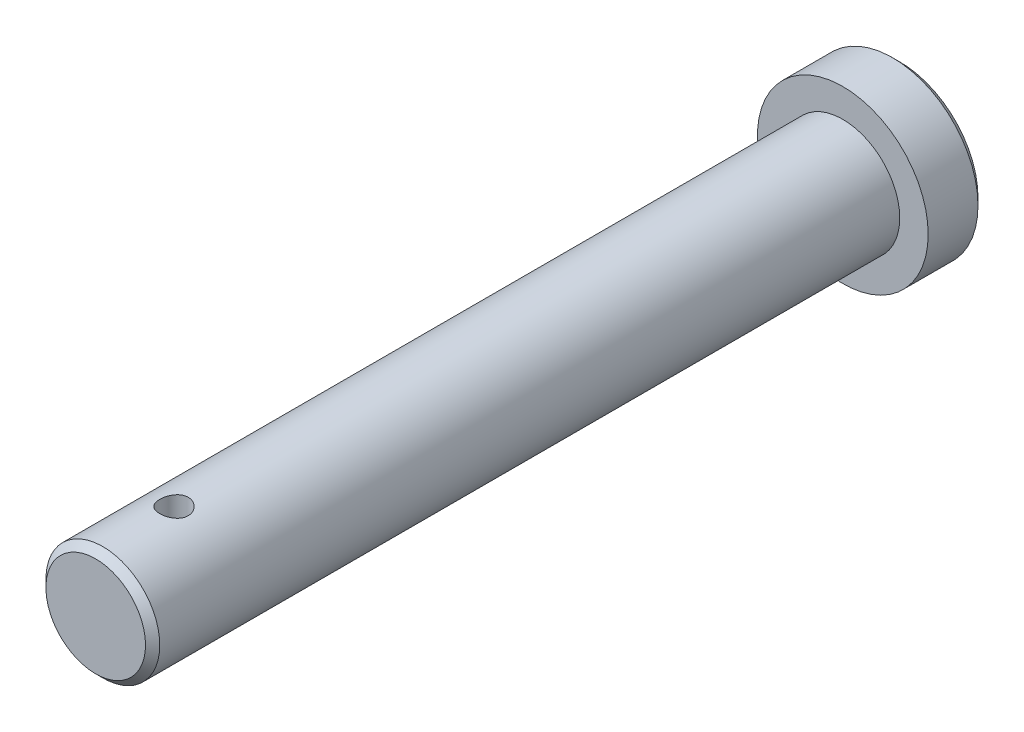
ISO-10303-21;
HEADER;
FILE_DESCRIPTION(('STEP AP214'),'2;1');
FILE_NAME('part.step','',(''),(''),'','','');
FILE_SCHEMA(('AUTOMOTIVE_DESIGN { 1 0 10303 214 1 1 1 1 }'));
ENDSEC;
DATA;
#1=APPLICATION_CONTEXT('core data for automotive mechanical design processes');
#2=APPLICATION_PROTOCOL_DEFINITION('international standard','automotive_design',2000,#1);
#3=PRODUCT_CONTEXT('',#1,'mechanical');
#4=PRODUCT('Part','Part','',(#3));
#5=PRODUCT_RELATED_PRODUCT_CATEGORY('part','',(#4));
#6=PRODUCT_DEFINITION_FORMATION('','',#4);
#7=PRODUCT_DEFINITION_CONTEXT('part definition',#1,'design');
#8=PRODUCT_DEFINITION('design','',#6,#7);
#9=PRODUCT_DEFINITION_SHAPE('','',#8);
#10=(LENGTH_UNIT() NAMED_UNIT(*) SI_UNIT(.MILLI.,.METRE.));
#11=(NAMED_UNIT(*) PLANE_ANGLE_UNIT() SI_UNIT($,.RADIAN.));
#12=(NAMED_UNIT(*) SI_UNIT($,.STERADIAN.) SOLID_ANGLE_UNIT());
#13=UNCERTAINTY_MEASURE_WITH_UNIT(LENGTH_MEASURE(1.E-05),#10,'distance_accuracy_value','');
#14=(GEOMETRIC_REPRESENTATION_CONTEXT(3) GLOBAL_UNCERTAINTY_ASSIGNED_CONTEXT((#13)) GLOBAL_UNIT_ASSIGNED_CONTEXT((#10,
#11,#12)) REPRESENTATION_CONTEXT('',''));
#15=CARTESIAN_POINT('',(0.,0.,0.));
#16=DIRECTION('',(0.,0.,1.));
#17=DIRECTION('',(1.,0.,0.));
#18=AXIS2_PLACEMENT_3D('',#15,#16,#17);
#19=CARTESIAN_POINT('',(0.,0.,8.));
#20=DIRECTION('',(0.,0.,-1.));
#21=DIRECTION('',(-1.,0.,0.));
#22=AXIS2_PLACEMENT_3D('',#19,#20,#21);
#23=CYLINDRICAL_SURFACE('',#22,12.);
#24=CARTESIAN_POINT('',(0.,0.,1.));
#25=DIRECTION('',(0.,0.,1.));
#26=DIRECTION('',(1.,0.,0.));
#27=AXIS2_PLACEMENT_3D('',#24,#25,#26);
#28=CIRCLE('',#27,12.);
#29=CARTESIAN_POINT('',(12.,0.,1.));
#30=VERTEX_POINT('',#29);
#31=EDGE_CURVE('E99',#30,#30,#28,.T.);
#32=ORIENTED_EDGE('',*,*,#31,.T.);
#33=EDGE_LOOP('',(#32));
#34=FACE_BOUND('',#33,.T.);
#35=CARTESIAN_POINT('',(0.,0.,8.));
#36=DIRECTION('',(0.,0.,1.));
#37=DIRECTION('',(1.,0.,0.));
#38=AXIS2_PLACEMENT_3D('',#35,#36,#37);
#39=CIRCLE('',#38,12.);
#40=CARTESIAN_POINT('',(12.,0.,8.));
#41=VERTEX_POINT('',#40);
#42=EDGE_CURVE('E100',#41,#41,#39,.T.);
#43=ORIENTED_EDGE('',*,*,#42,.F.);
#44=EDGE_LOOP('',(#43));
#45=FACE_BOUND('',#44,.T.);
#46=ADVANCED_FACE('F31',(#34,#45),#23,.T.);
#47=CARTESIAN_POINT('',(0.,0.,8.));
#48=DIRECTION('',(0.,0.,1.));
#49=DIRECTION('',(1.,0.,0.));
#50=AXIS2_PLACEMENT_3D('',#47,#48,#49);
#51=PLANE('',#50);
#52=CARTESIAN_POINT('',(0.,0.,8.));
#53=DIRECTION('',(0.,0.,1.));
#54=DIRECTION('',(1.,0.,0.));
#55=AXIS2_PLACEMENT_3D('',#52,#53,#54);
#56=CIRCLE('',#55,8.);
#57=CARTESIAN_POINT('',(8.,0.,8.));
#58=VERTEX_POINT('',#57);
#59=EDGE_CURVE('E49',#58,#58,#56,.T.);
#60=ORIENTED_EDGE('',*,*,#59,.F.);
#61=EDGE_LOOP('',(#60));
#62=FACE_BOUND('',#61,.T.);
#63=ORIENTED_EDGE('',*,*,#42,.T.);
#64=EDGE_LOOP('',(#63));
#65=FACE_BOUND('',#64,.T.);
#66=ADVANCED_FACE('F77',(#62,#65),#51,.T.);
#67=CARTESIAN_POINT('',(0.,0.,0.));
#68=DIRECTION('',(0.,0.,1.));
#69=DIRECTION('',(1.,0.,0.));
#70=AXIS2_PLACEMENT_3D('',#67,#68,#69);
#71=PLANE('',#70);
#72=CARTESIAN_POINT('',(0.,0.,0.));
#73=DIRECTION('',(0.,0.,1.));
#74=DIRECTION('',(1.,0.,0.));
#75=AXIS2_PLACEMENT_3D('',#72,#73,#74);
#76=CIRCLE('',#75,11.);
#77=CARTESIAN_POINT('',(11.,0.,0.));
#78=VERTEX_POINT('',#77);
#79=EDGE_CURVE('E97',#78,#78,#76,.F.);
#80=ORIENTED_EDGE('',*,*,#79,.T.);
#81=EDGE_LOOP('',(#80));
#82=FACE_BOUND('',#81,.T.);
#83=ADVANCED_FACE('F83',(#82),#71,.F.);
#84=CARTESIAN_POINT('',(0.,0.,1.));
#85=DIRECTION('',(0.,0.,1.));
#86=DIRECTION('',(1.,0.,0.));
#87=AXIS2_PLACEMENT_3D('',#84,#85,#86);
#88=CONICAL_SURFACE('',#87,12.,0.785398163397449);
#89=ORIENTED_EDGE('',*,*,#79,.F.);
#90=EDGE_LOOP('',(#89));
#91=FACE_BOUND('',#90,.T.);
#92=ORIENTED_EDGE('',*,*,#31,.F.);
#93=EDGE_LOOP('',(#92));
#94=FACE_BOUND('',#93,.T.);
#95=ADVANCED_FACE('F74',(#91,#94),#88,.T.);
#96=CARTESIAN_POINT('',(0.,0.,113.));
#97=DIRECTION('',(0.,0.,-1.));
#98=DIRECTION('',(-1.,0.,0.));
#99=AXIS2_PLACEMENT_3D('',#96,#97,#98);
#100=CYLINDRICAL_SURFACE('',#99,8.);
#101=CARTESIAN_POINT('',(0.,-8.,104.));
#102=CARTESIAN_POINT('',(0.110501451559641,-7.9999981315735,103.999996899016));
#103=CARTESIAN_POINT('',(0.22103754377435,-7.99768770842435,103.990811265635));
#104=CARTESIAN_POINT('',(0.438941765027375,-7.98869485106526,103.954366464924));
#105=CARTESIAN_POINT('',(0.546308062494318,-7.98200993893301,103.92709705395));
#106=CARTESIAN_POINT('',(0.754694496243438,-7.96500835109376,103.855414328717));
#107=CARTESIAN_POINT('',(0.855722084573341,-7.95469603789411,103.811021601713));
#108=CARTESIAN_POINT('',(1.04889617587257,-7.93153791743495,103.706424813274));
#109=CARTESIAN_POINT('',(1.14104237913168,-7.91869202472209,103.646220218508));
#110=CARTESIAN_POINT('',(1.31573590306788,-7.89156551455591,103.510398947128));
#111=CARTESIAN_POINT('',(1.39807425341474,-7.87726276197502,103.434517900055));
#112=CARTESIAN_POINT('',(1.54899856960442,-7.84898160157248,103.270063726788));
#113=CARTESIAN_POINT('',(1.61758298259892,-7.83500323053157,103.181489169404));
#114=CARTESIAN_POINT('',(1.74003539039863,-7.80873034264225,102.992539697684));
#115=CARTESIAN_POINT('',(1.79366962123352,-7.79646392619748,102.892009025588));
#116=CARTESIAN_POINT('',(1.88319587806766,-7.77532659757355,102.683002117787));
#117=CARTESIAN_POINT('',(1.91909074058685,-7.76645514259225,102.574527155557));
#118=CARTESIAN_POINT('',(1.97140644907302,-7.7533396892843,102.355008669064));
#119=CARTESIAN_POINT('',(1.98820302444274,-7.74900654662681,102.244060138616));
#120=CARTESIAN_POINT('',(2.00301570008854,-7.74519149946122,102.020841908001));
#121=CARTESIAN_POINT('',(2.00103485575748,-7.74570880570571,101.908572425744));
#122=CARTESIAN_POINT('',(1.97864869951961,-7.75145607355756,101.688778923006));
#123=CARTESIAN_POINT('',(1.95869112025418,-7.75657150676391,101.581205838046));
#124=CARTESIAN_POINT('',(1.90163224920399,-7.77075612894758,101.370985265452));
#125=CARTESIAN_POINT('',(1.86452973609253,-7.77982559958985,101.268338129295));
#126=CARTESIAN_POINT('',(1.77385263724958,-7.80100151874212,101.069682644997));
#127=CARTESIAN_POINT('',(1.72011555631056,-7.81313769959755,100.973751770947));
#128=CARTESIAN_POINT('',(1.59780836801993,-7.83906281127988,100.792108386991));
#129=CARTESIAN_POINT('',(1.52923566507845,-7.85285203112837,100.706397669244));
#130=CARTESIAN_POINT('',(1.37688456624163,-7.88101174053188,100.545061845741));
#131=CARTESIAN_POINT('',(1.29272834422115,-7.89538759304001,100.469794013252));
#132=CARTESIAN_POINT('',(1.11281589000494,-7.92274620771675,100.334371676715));
#133=CARTESIAN_POINT('',(1.0170593036106,-7.93572892732543,100.274217634315));
#134=CARTESIAN_POINT('',(0.816154518241863,-7.9589030945892,100.170599218367));
#135=CARTESIAN_POINT('',(0.710975190944839,-7.96908480170303,100.127192879661));
#136=CARTESIAN_POINT('',(0.494501344190514,-7.98543889321888,100.058776925721));
#137=CARTESIAN_POINT('',(0.383207998867314,-7.99161204452374,100.033763791442));
#138=CARTESIAN_POINT('',(0.160719960520034,-7.999139990285,100.003389912588));
#139=CARTESIAN_POINT('',(0.0495956266509452,-8.00061404677705,99.9975426318996));
#140=CARTESIAN_POINT('',(-0.172043833068677,-7.99891739752601,100.004332002741));
#141=CARTESIAN_POINT('',(-0.282559012859458,-7.99574710989128,100.016966990399));
#142=CARTESIAN_POINT('',(-0.498152358368654,-7.98519441503143,100.059961211188));
#143=CARTESIAN_POINT('',(-0.603286825291672,-7.97787512247748,100.090055017969));
#144=CARTESIAN_POINT('',(-0.807009723270014,-7.95984942178845,100.166809445371));
#145=CARTESIAN_POINT('',(-0.905597492043511,-7.94914267159856,100.213471739084));
#146=CARTESIAN_POINT('',(-1.09536417923979,-7.92524410568414,100.322981505166));
#147=CARTESIAN_POINT('',(-1.18638058911444,-7.91201156489243,100.386101483196));
#148=CARTESIAN_POINT('',(-1.35670215152433,-7.88459345583226,100.526386545063));
#149=CARTESIAN_POINT('',(-1.43600527863068,-7.87040772335606,100.603554052823));
#150=CARTESIAN_POINT('',(-1.58265409076364,-7.84225275947695,100.772002614459));
#151=CARTESIAN_POINT('',(-1.6496584901627,-7.82829738916375,100.863583604003));
#152=CARTESIAN_POINT('',(-1.76734767868359,-7.80257171169652,101.056976845954));
#153=CARTESIAN_POINT('',(-1.81803319221058,-7.79080130756035,101.158788643946));
#154=CARTESIAN_POINT('',(-1.90126856081238,-7.77090792979553,101.369207629884));
#155=CARTESIAN_POINT('',(-1.93392586220542,-7.76276340389207,101.477770171125));
#156=CARTESIAN_POINT('',(-1.98046087993837,-7.75102325453578,101.699079517185));
#157=CARTESIAN_POINT('',(-1.99434270330488,-7.74742663626582,101.811825401377));
#158=CARTESIAN_POINT('',(-2.00271812044533,-7.74526534938609,102.034828031807));
#159=CARTESIAN_POINT('',(-1.99775719704016,-7.74655910304351,102.145063246833));
#160=CARTESIAN_POINT('',(-1.96983637108382,-7.7537054534379,102.363071851557));
#161=CARTESIAN_POINT('',(-1.94687683024903,-7.75955795855809,102.470845290685));
#162=CARTESIAN_POINT('',(-1.88390842592373,-7.77508347576963,102.680277945421));
#163=CARTESIAN_POINT('',(-1.84400187290717,-7.78473353648412,102.78196974032));
#164=CARTESIAN_POINT('',(-1.7483532181401,-7.80677007633104,102.977287176952));
#165=CARTESIAN_POINT('',(-1.69260892004559,-7.81915693494364,103.070911697583));
#166=CARTESIAN_POINT('',(-1.56515699818286,-7.84567512351349,103.250072838669));
#167=CARTESIAN_POINT('',(-1.49307088388301,-7.85984353109009,103.335334764565));
#168=CARTESIAN_POINT('',(-1.33571916158632,-7.88810702995047,103.492729393061));
#169=CARTESIAN_POINT('',(-1.2504504283482,-7.90220210302746,103.564858973484));
#170=CARTESIAN_POINT('',(-1.06729011560345,-7.92903540863551,103.695215078086));
#171=CARTESIAN_POINT('',(-0.969197896421848,-7.94174444487824,103.753166151562));
#172=CARTESIAN_POINT('',(-0.764354746013968,-7.96406566633491,103.851663283921));
#173=CARTESIAN_POINT('',(-0.65761008458232,-7.97368006933042,103.892221814198));
#174=CARTESIAN_POINT('',(-0.459213670991296,-7.98730746087389,103.94876244044));
#175=CARTESIAN_POINT('',(-0.368506894544091,-7.9920344673692,103.967934990738));
#176=CARTESIAN_POINT('',(-0.185208095381711,-7.99838140309264,103.993554591496));
#177=CARTESIAN_POINT('',(-0.092616214990155,-8.00000156601192,104.000002599074));
#178=CARTESIAN_POINT('',(0.,-8.,104.));
#179=B_SPLINE_CURVE_WITH_KNOTS('',3,(#101,#102,#103,#104,#105,#106,#107,#108,#109,#110,#111,
#112,#113,#114,#115,#116,#117,#118,#119,#120,#121,#122,#123,#124,#125,#126,#127,#128,#129,#130,
#131,#132,#133,#134,#135,#136,#137,#138,#139,#140,#141,#142,#143,#144,#145,#146,#147,#148,#149,
#150,#151,#152,#153,#154,#155,#156,#157,#158,#159,#160,#161,#162,#163,#164,#165,#166,#167,#168,
#169,#170,#171,#172,#173,#174,#175,#176,#177,#178),.UNSPECIFIED.,.T.,.F.,(4,2,2,2,2,2,2,2,2,2,2,
2,2,2,2,2,2,2,2,2,2,2,2,2,2,2,2,2,2,2,2,2,2,2,2,2,2,2,4),(0.,0.331164949962518,
0.662517650351866,0.993473203048152,1.32443992022577,1.66152580582851,1.99864972773416,
2.34078196727742,2.68285948225824,3.01808393468093,3.35325384154689,3.68029996013784,
4.00736937959146,4.33774037169599,4.66816921119311,5.00802001296453,5.34788119415423,
5.68890972016579,6.02987298255951,6.36211078603462,6.69431868154751,7.02160366023144,
7.34892169767481,7.68204783424896,8.01523150681786,8.35659345610394,8.69794025003771,
9.03723006156475,9.3764456434097,9.70591707202578,10.0353818794581,10.3628853408369,
10.6904342418696,11.0265276855097,11.3627009303165,11.7049624733721,12.0469781843289,
12.3245632392729,12.6021274139515),.UNSPECIFIED.);
#180=CARTESIAN_POINT('',(0.,-8.,104.));
#181=VERTEX_POINT('',#180);
#182=EDGE_CURVE('E35',#181,#181,#179,.T.);
#183=ORIENTED_EDGE('',*,*,#182,.T.);
#184=EDGE_LOOP('',(#183));
#185=FACE_BOUND('',#184,.T.);
#186=CARTESIAN_POINT('',(0.,8.,104.));
#187=CARTESIAN_POINT('',(-0.110501451559641,7.9999981315735,103.999996899016));
#188=CARTESIAN_POINT('',(-0.22103754377435,7.99768770842435,103.990811265635));
#189=CARTESIAN_POINT('',(-0.438941765027375,7.98869485106526,103.954366464924));
#190=CARTESIAN_POINT('',(-0.546308062494318,7.98200993893301,103.92709705395));
#191=CARTESIAN_POINT('',(-0.754694496243438,7.96500835109376,103.855414328717));
#192=CARTESIAN_POINT('',(-0.855722084573341,7.95469603789411,103.811021601713));
#193=CARTESIAN_POINT('',(-1.04889617587257,7.93153791743495,103.706424813274));
#194=CARTESIAN_POINT('',(-1.14104237913168,7.91869202472209,103.646220218508));
#195=CARTESIAN_POINT('',(-1.31573590306788,7.89156551455591,103.510398947128));
#196=CARTESIAN_POINT('',(-1.39807425341474,7.87726276197502,103.434517900055));
#197=CARTESIAN_POINT('',(-1.54899856960442,7.84898160157248,103.270063726788));
#198=CARTESIAN_POINT('',(-1.61758298259892,7.83500323053157,103.181489169404));
#199=CARTESIAN_POINT('',(-1.74003539039863,7.80873034264225,102.992539697684));
#200=CARTESIAN_POINT('',(-1.79366962123352,7.79646392619748,102.892009025588));
#201=CARTESIAN_POINT('',(-1.88319587806766,7.77532659757355,102.683002117787));
#202=CARTESIAN_POINT('',(-1.91909074058685,7.76645514259225,102.574527155557));
#203=CARTESIAN_POINT('',(-1.97140644907302,7.7533396892843,102.355008669064));
#204=CARTESIAN_POINT('',(-1.98820302444274,7.74900654662681,102.244060138616));
#205=CARTESIAN_POINT('',(-2.00301570008854,7.74519149946122,102.020841908001));
#206=CARTESIAN_POINT('',(-2.00103485575748,7.74570880570571,101.908572425744));
#207=CARTESIAN_POINT('',(-1.97864869951961,7.75145607355756,101.688778923006));
#208=CARTESIAN_POINT('',(-1.95869112025418,7.75657150676391,101.581205838046));
#209=CARTESIAN_POINT('',(-1.90163224920399,7.77075612894758,101.370985265452));
#210=CARTESIAN_POINT('',(-1.86452973609253,7.77982559958985,101.268338129295));
#211=CARTESIAN_POINT('',(-1.77385263724958,7.80100151874212,101.069682644997));
#212=CARTESIAN_POINT('',(-1.72011555631056,7.81313769959755,100.973751770947));
#213=CARTESIAN_POINT('',(-1.59780836801993,7.83906281127988,100.792108386991));
#214=CARTESIAN_POINT('',(-1.52923566507845,7.85285203112837,100.706397669244));
#215=CARTESIAN_POINT('',(-1.37688456624163,7.88101174053188,100.545061845741));
#216=CARTESIAN_POINT('',(-1.29272834422115,7.89538759304001,100.469794013252));
#217=CARTESIAN_POINT('',(-1.11281589000494,7.92274620771675,100.334371676715));
#218=CARTESIAN_POINT('',(-1.0170593036106,7.93572892732543,100.274217634315));
#219=CARTESIAN_POINT('',(-0.816154518241863,7.9589030945892,100.170599218367));
#220=CARTESIAN_POINT('',(-0.710975190944839,7.96908480170303,100.127192879661));
#221=CARTESIAN_POINT('',(-0.494501344190514,7.98543889321888,100.058776925721));
#222=CARTESIAN_POINT('',(-0.383207998867314,7.99161204452374,100.033763791442));
#223=CARTESIAN_POINT('',(-0.160719960520034,7.999139990285,100.003389912588));
#224=CARTESIAN_POINT('',(-0.0495956266509452,8.00061404677705,99.9975426318996));
#225=CARTESIAN_POINT('',(0.172043833068677,7.99891739752601,100.004332002741));
#226=CARTESIAN_POINT('',(0.282559012859458,7.99574710989128,100.016966990399));
#227=CARTESIAN_POINT('',(0.498152358368654,7.98519441503143,100.059961211188));
#228=CARTESIAN_POINT('',(0.603286825291672,7.97787512247748,100.090055017969));
#229=CARTESIAN_POINT('',(0.807009723270014,7.95984942178845,100.166809445371));
#230=CARTESIAN_POINT('',(0.905597492043511,7.94914267159856,100.213471739084));
#231=CARTESIAN_POINT('',(1.09536417923979,7.92524410568414,100.322981505166));
#232=CARTESIAN_POINT('',(1.18638058911444,7.91201156489243,100.386101483196));
#233=CARTESIAN_POINT('',(1.35670215152433,7.88459345583226,100.526386545063));
#234=CARTESIAN_POINT('',(1.43600527863068,7.87040772335606,100.603554052823));
#235=CARTESIAN_POINT('',(1.58265409076364,7.84225275947695,100.772002614459));
#236=CARTESIAN_POINT('',(1.6496584901627,7.82829738916375,100.863583604003));
#237=CARTESIAN_POINT('',(1.76734767868359,7.80257171169652,101.056976845954));
#238=CARTESIAN_POINT('',(1.81803319221058,7.79080130756035,101.158788643946));
#239=CARTESIAN_POINT('',(1.90126856081238,7.77090792979553,101.369207629884));
#240=CARTESIAN_POINT('',(1.93392586220542,7.76276340389207,101.477770171125));
#241=CARTESIAN_POINT('',(1.98046087993837,7.75102325453578,101.699079517185));
#242=CARTESIAN_POINT('',(1.99434270330488,7.74742663626582,101.811825401377));
#243=CARTESIAN_POINT('',(2.00271812044533,7.74526534938609,102.034828031807));
#244=CARTESIAN_POINT('',(1.99775719704016,7.74655910304351,102.145063246833));
#245=CARTESIAN_POINT('',(1.96983637108382,7.7537054534379,102.363071851557));
#246=CARTESIAN_POINT('',(1.94687683024903,7.75955795855809,102.470845290685));
#247=CARTESIAN_POINT('',(1.88390842592373,7.77508347576963,102.680277945421));
#248=CARTESIAN_POINT('',(1.84400187290717,7.78473353648412,102.78196974032));
#249=CARTESIAN_POINT('',(1.7483532181401,7.80677007633104,102.977287176952));
#250=CARTESIAN_POINT('',(1.69260892004559,7.81915693494364,103.070911697583));
#251=CARTESIAN_POINT('',(1.56515699818286,7.84567512351349,103.250072838669));
#252=CARTESIAN_POINT('',(1.49307088388301,7.85984353109009,103.335334764565));
#253=CARTESIAN_POINT('',(1.33571916158632,7.88810702995047,103.492729393061));
#254=CARTESIAN_POINT('',(1.2504504283482,7.90220210302746,103.564858973484));
#255=CARTESIAN_POINT('',(1.06729011560345,7.92903540863551,103.695215078086));
#256=CARTESIAN_POINT('',(0.969197896421848,7.94174444487824,103.753166151562));
#257=CARTESIAN_POINT('',(0.764354746013968,7.96406566633491,103.851663283921));
#258=CARTESIAN_POINT('',(0.65761008458232,7.97368006933042,103.892221814198));
#259=CARTESIAN_POINT('',(0.459213670991296,7.98730746087389,103.94876244044));
#260=CARTESIAN_POINT('',(0.368506894544091,7.9920344673692,103.967934990738));
#261=CARTESIAN_POINT('',(0.185208095381711,7.99838140309264,103.993554591496));
#262=CARTESIAN_POINT('',(0.092616214990155,8.00000156601192,104.000002599074));
#263=CARTESIAN_POINT('',(0.,8.,104.));
#264=B_SPLINE_CURVE_WITH_KNOTS('',3,(#186,#187,#188,#189,#190,#191,#192,#193,#194,#195,#196,
#197,#198,#199,#200,#201,#202,#203,#204,#205,#206,#207,#208,#209,#210,#211,#212,#213,#214,#215,
#216,#217,#218,#219,#220,#221,#222,#223,#224,#225,#226,#227,#228,#229,#230,#231,#232,#233,#234,
#235,#236,#237,#238,#239,#240,#241,#242,#243,#244,#245,#246,#247,#248,#249,#250,#251,#252,#253,
#254,#255,#256,#257,#258,#259,#260,#261,#262,#263),.UNSPECIFIED.,.T.,.F.,(4,2,2,2,2,2,2,2,2,2,2,
2,2,2,2,2,2,2,2,2,2,2,2,2,2,2,2,2,2,2,2,2,2,2,2,2,2,2,4),(0.,0.331164949962518,
0.662517650351866,0.993473203048152,1.32443992022577,1.66152580582851,1.99864972773416,
2.34078196727742,2.68285948225824,3.01808393468093,3.35325384154689,3.68029996013784,
4.00736937959146,4.33774037169599,4.66816921119311,5.00802001296453,5.34788119415423,
5.68890972016579,6.02987298255951,6.36211078603462,6.69431868154751,7.02160366023144,
7.34892169767481,7.68204783424896,8.01523150681786,8.35659345610394,8.69794025003771,
9.03723006156475,9.3764456434097,9.70591707202578,10.0353818794581,10.3628853408369,
10.6904342418696,11.0265276855097,11.3627009303165,11.7049624733721,12.0469781843289,
12.3245632392729,12.6021274139515),.UNSPECIFIED.);
#265=CARTESIAN_POINT('',(0.,8.,104.));
#266=VERTEX_POINT('',#265);
#267=EDGE_CURVE('E52',#266,#266,#264,.T.);
#268=ORIENTED_EDGE('',*,*,#267,.T.);
#269=EDGE_LOOP('',(#268));
#270=FACE_BOUND('',#269,.T.);
#271=CARTESIAN_POINT('',(0.,0.,112.));
#272=DIRECTION('',(0.,0.,1.));
#273=DIRECTION('',(1.,0.,0.));
#274=AXIS2_PLACEMENT_3D('',#271,#272,#273);
#275=CIRCLE('',#274,8.);
#276=CARTESIAN_POINT('',(8.,0.,112.));
#277=VERTEX_POINT('',#276);
#278=EDGE_CURVE('E10',#277,#277,#275,.F.);
#279=ORIENTED_EDGE('',*,*,#278,.T.);
#280=EDGE_LOOP('',(#279));
#281=FACE_BOUND('',#280,.T.);
#282=ORIENTED_EDGE('',*,*,#59,.T.);
#283=EDGE_LOOP('',(#282));
#284=FACE_BOUND('',#283,.T.);
#285=ADVANCED_FACE('F57',(#185,#270,#281,#284),#100,.T.);
#286=CARTESIAN_POINT('',(0.,0.,113.));
#287=DIRECTION('',(0.,0.,1.));
#288=DIRECTION('',(1.,0.,0.));
#289=AXIS2_PLACEMENT_3D('',#286,#287,#288);
#290=PLANE('',#289);
#291=CARTESIAN_POINT('',(0.,0.,113.));
#292=DIRECTION('',(0.,0.,1.));
#293=DIRECTION('',(1.,0.,0.));
#294=AXIS2_PLACEMENT_3D('',#291,#292,#293);
#295=CIRCLE('',#294,7.00000000000001);
#296=CARTESIAN_POINT('',(7.00000000000001,0.,113.));
#297=VERTEX_POINT('',#296);
#298=EDGE_CURVE('E44',#297,#297,#295,.T.);
#299=ORIENTED_EDGE('',*,*,#298,.T.);
#300=EDGE_LOOP('',(#299));
#301=FACE_BOUND('',#300,.T.);
#302=ADVANCED_FACE('F65',(#301),#290,.T.);
#303=CARTESIAN_POINT('',(0.,0.,113.));
#304=DIRECTION('',(0.,0.,-1.));
#305=DIRECTION('',(-1.,0.,0.));
#306=AXIS2_PLACEMENT_3D('',#303,#304,#305);
#307=CONICAL_SURFACE('',#306,7.00000000000001,0.785398163397445);
#308=ORIENTED_EDGE('',*,*,#278,.F.);
#309=EDGE_LOOP('',(#308));
#310=FACE_BOUND('',#309,.T.);
#311=ORIENTED_EDGE('',*,*,#298,.F.);
#312=EDGE_LOOP('',(#311));
#313=FACE_BOUND('',#312,.T.);
#314=ADVANCED_FACE('F33',(#310,#313),#307,.T.);
#315=CARTESIAN_POINT('',(0.,-17.5,102.));
#316=DIRECTION('',(0.,1.,0.));
#317=DIRECTION('',(0.,0.,1.));
#318=AXIS2_PLACEMENT_3D('',#315,#316,#317);
#319=CYLINDRICAL_SURFACE('',#318,2.);
#320=ORIENTED_EDGE('',*,*,#267,.F.);
#321=EDGE_LOOP('',(#320));
#322=FACE_BOUND('',#321,.T.);
#323=ORIENTED_EDGE('',*,*,#182,.F.);
#324=EDGE_LOOP('',(#323));
#325=FACE_BOUND('',#324,.T.);
#326=ADVANCED_FACE('F61',(#322,#325),#319,.F.);
#327=CLOSED_SHELL('',(#46,#66,#83,#95,#285,#302,#314,#326));
#328=MANIFOLD_SOLID_BREP('B2',#327);
#329=ADVANCED_BREP_SHAPE_REPRESENTATION('',(#18,#328),#14);
#330=SHAPE_DEFINITION_REPRESENTATION(#9,#329);
ENDSEC;
END-ISO-10303-21;
